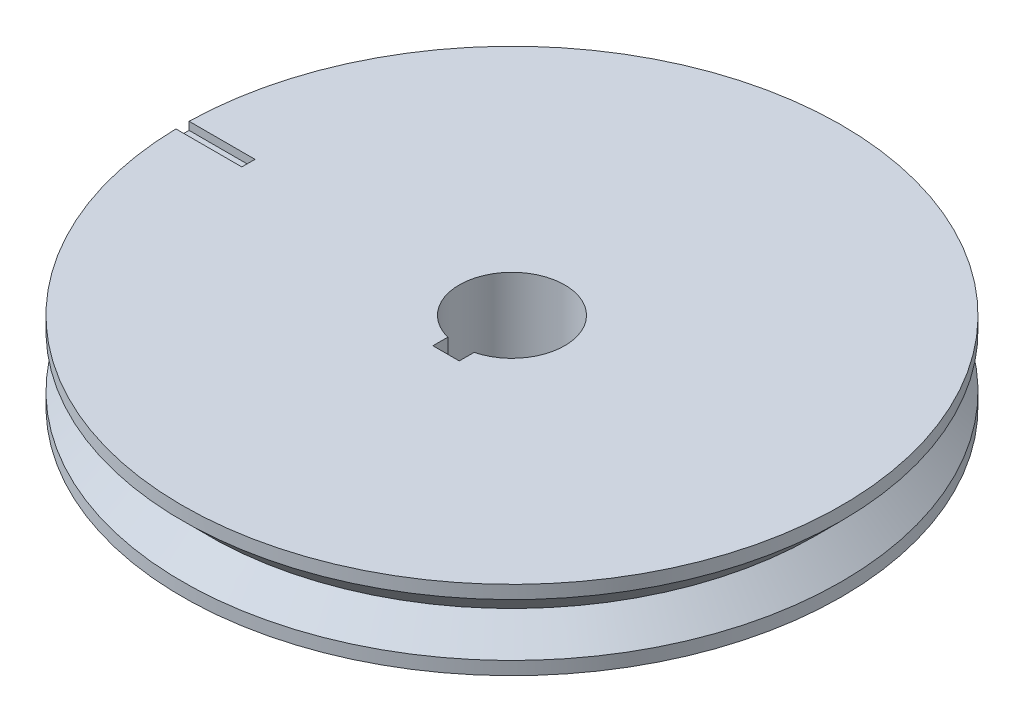
ISO-10303-21;
HEADER;
FILE_DESCRIPTION(('STEP AP214'),'2;1');
FILE_NAME('part.step','',(''),(''),'','','');
FILE_SCHEMA(('AUTOMOTIVE_DESIGN { 1 0 10303 214 1 1 1 1 }'));
ENDSEC;
DATA;
#1=APPLICATION_CONTEXT('core data for automotive mechanical design processes');
#2=APPLICATION_PROTOCOL_DEFINITION('international standard','automotive_design',2000,#1);
#3=PRODUCT_CONTEXT('',#1,'mechanical');
#4=PRODUCT('Part','Part','',(#3));
#5=PRODUCT_RELATED_PRODUCT_CATEGORY('part','',(#4));
#6=PRODUCT_DEFINITION_FORMATION('','',#4);
#7=PRODUCT_DEFINITION_CONTEXT('part definition',#1,'design');
#8=PRODUCT_DEFINITION('design','',#6,#7);
#9=PRODUCT_DEFINITION_SHAPE('','',#8);
#10=(LENGTH_UNIT() NAMED_UNIT(*) SI_UNIT(.MILLI.,.METRE.));
#11=(NAMED_UNIT(*) PLANE_ANGLE_UNIT() SI_UNIT($,.RADIAN.));
#12=(NAMED_UNIT(*) SI_UNIT($,.STERADIAN.) SOLID_ANGLE_UNIT());
#13=UNCERTAINTY_MEASURE_WITH_UNIT(LENGTH_MEASURE(1.E-05),#10,'distance_accuracy_value','');
#14=(GEOMETRIC_REPRESENTATION_CONTEXT(3) GLOBAL_UNCERTAINTY_ASSIGNED_CONTEXT((#13)) GLOBAL_UNIT_ASSIGNED_CONTEXT((#10,
#11,#12)) REPRESENTATION_CONTEXT('',''));
#15=CARTESIAN_POINT('',(0.,0.,0.));
#16=DIRECTION('',(0.,0.,1.));
#17=DIRECTION('',(1.,0.,0.));
#18=AXIS2_PLACEMENT_3D('',#15,#16,#17);
#19=CARTESIAN_POINT('',(0.,-15.,0.));
#20=DIRECTION('',(0.,1.,0.));
#21=DIRECTION('',(-1.,0.,0.));
#22=AXIS2_PLACEMENT_3D('',#19,#20,#21);
#23=PLANE('',#22);
#24=CARTESIAN_POINT('',(0.,-15.,0.));
#25=DIRECTION('',(0.,1.,0.));
#26=DIRECTION('',(-1.,0.,0.));
#27=AXIS2_PLACEMENT_3D('',#24,#25,#26);
#28=CIRCLE('',#27,20.);
#29=CARTESIAN_POINT('',(5.,-15.,19.3649167310371));
#30=VERTEX_POINT('',#29);
#31=CARTESIAN_POINT('',(-5.,-15.,19.3649167310371));
#32=VERTEX_POINT('',#31);
#33=EDGE_CURVE('E151',#30,#32,#28,.T.);
#34=ORIENTED_EDGE('',*,*,#33,.T.);
#35=DIRECTION('',(0.,0.,1.));
#36=VECTOR('',#35,1.);
#37=CARTESIAN_POINT('',(-5.,-15.,19.3649167310371));
#38=LINE('',#37,#36);
#39=CARTESIAN_POINT('',(-5.,-15.,25.));
#40=VERTEX_POINT('',#39);
#41=EDGE_CURVE('E154',#32,#40,#38,.T.);
#42=ORIENTED_EDGE('',*,*,#41,.T.);
#43=DIRECTION('',(1.,0.,0.));
#44=VECTOR('',#43,1.);
#45=CARTESIAN_POINT('',(5.,-15.,25.));
#46=LINE('',#45,#44);
#47=CARTESIAN_POINT('',(5.,-15.,25.));
#48=VERTEX_POINT('',#47);
#49=EDGE_CURVE('E159',#40,#48,#46,.T.);
#50=ORIENTED_EDGE('',*,*,#49,.T.);
#51=DIRECTION('',(0.,0.,-1.));
#52=VECTOR('',#51,1.);
#53=CARTESIAN_POINT('',(5.,-15.,19.3649167310371));
#54=LINE('',#53,#52);
#55=EDGE_CURVE('E56',#48,#30,#54,.T.);
#56=ORIENTED_EDGE('',*,*,#55,.T.);
#57=EDGE_LOOP('',(#34,#42,#50,#56));
#58=FACE_BOUND('',#57,.T.);
#59=CARTESIAN_POINT('',(0.,-15.,0.));
#60=DIRECTION('',(0.,1.,0.));
#61=DIRECTION('',(-1.,0.,0.));
#62=AXIS2_PLACEMENT_3D('',#59,#60,#61);
#63=CIRCLE('',#62,125.);
#64=CARTESIAN_POINT('',(-125.,-15.,0.));
#65=VERTEX_POINT('',#64);
#66=EDGE_CURVE('E11',#65,#65,#63,.T.);
#67=ORIENTED_EDGE('',*,*,#66,.F.);
#68=EDGE_LOOP('',(#67));
#69=FACE_BOUND('',#68,.T.);
#70=ADVANCED_FACE('F34',(#58,#69),#23,.F.);
#71=CARTESIAN_POINT('',(0.,-15.,0.));
#72=DIRECTION('',(0.,1.,0.));
#73=DIRECTION('',(-1.,0.,0.));
#74=AXIS2_PLACEMENT_3D('',#71,#72,#73);
#75=CYLINDRICAL_SURFACE('',#74,125.);
#76=CARTESIAN_POINT('',(0.,-10.,0.));
#77=DIRECTION('',(0.,1.,0.));
#78=DIRECTION('',(-1.,0.,0.));
#79=AXIS2_PLACEMENT_3D('',#76,#77,#78);
#80=CIRCLE('',#79,125.);
#81=CARTESIAN_POINT('',(-125.,-10.,0.));
#82=VERTEX_POINT('',#81);
#83=EDGE_CURVE('E41',#82,#82,#80,.T.);
#84=ORIENTED_EDGE('',*,*,#83,.F.);
#85=EDGE_LOOP('',(#84));
#86=FACE_BOUND('',#85,.T.);
#87=ORIENTED_EDGE('',*,*,#66,.T.);
#88=EDGE_LOOP('',(#87));
#89=FACE_BOUND('',#88,.T.);
#90=ADVANCED_FACE('F139',(#86,#89),#75,.T.);
#91=CARTESIAN_POINT('',(0.,-10.,0.));
#92=DIRECTION('',(0.,-1.,0.));
#93=DIRECTION('',(1.,0.,0.));
#94=AXIS2_PLACEMENT_3D('',#91,#92,#93);
#95=CONICAL_SURFACE('',#94,125.,0.785398163397449);
#96=CARTESIAN_POINT('',(0.,0.,0.));
#97=DIRECTION('',(0.,1.,0.));
#98=DIRECTION('',(-1.,0.,0.));
#99=AXIS2_PLACEMENT_3D('',#96,#97,#98);
#100=CIRCLE('',#99,115.);
#101=CARTESIAN_POINT('',(-115.,0.,0.));
#102=VERTEX_POINT('',#101);
#103=EDGE_CURVE('E125',#102,#102,#100,.T.);
#104=ORIENTED_EDGE('',*,*,#103,.F.);
#105=EDGE_LOOP('',(#104));
#106=FACE_BOUND('',#105,.T.);
#107=ORIENTED_EDGE('',*,*,#83,.T.);
#108=EDGE_LOOP('',(#107));
#109=FACE_BOUND('',#108,.T.);
#110=ADVANCED_FACE('F137',(#106,#109),#95,.T.);
#111=CARTESIAN_POINT('',(0.,0.,0.));
#112=DIRECTION('',(0.,1.,0.));
#113=DIRECTION('',(-1.,0.,0.));
#114=AXIS2_PLACEMENT_3D('',#111,#112,#113);
#115=CONICAL_SURFACE('',#114,115.,0.785398163397449);
#116=CARTESIAN_POINT('',(0.,10.,0.));
#117=DIRECTION('',(0.,1.,0.));
#118=DIRECTION('',(-1.,0.,0.));
#119=AXIS2_PLACEMENT_3D('',#116,#117,#118);
#120=CIRCLE('',#119,125.);
#121=CARTESIAN_POINT('',(-125.,10.,0.));
#122=VERTEX_POINT('',#121);
#123=EDGE_CURVE('E121',#122,#122,#120,.T.);
#124=ORIENTED_EDGE('',*,*,#123,.F.);
#125=EDGE_LOOP('',(#124));
#126=FACE_BOUND('',#125,.T.);
#127=ORIENTED_EDGE('',*,*,#103,.T.);
#128=EDGE_LOOP('',(#127));
#129=FACE_BOUND('',#128,.T.);
#130=ADVANCED_FACE('F229',(#126,#129),#115,.T.);
#131=CARTESIAN_POINT('',(0.,-15.,0.));
#132=DIRECTION('',(0.,1.,0.));
#133=DIRECTION('',(-1.,0.,0.));
#134=AXIS2_PLACEMENT_3D('',#131,#132,#133);
#135=CYLINDRICAL_SURFACE('',#134,125.);
#136=CARTESIAN_POINT('',(0.,15.,0.));
#137=DIRECTION('',(0.,1.,0.));
#138=DIRECTION('',(-1.,0.,0.));
#139=AXIS2_PLACEMENT_3D('',#136,#137,#138);
#140=CIRCLE('',#139,125.);
#141=CARTESIAN_POINT('',(-124.9749974995,15.,2.50000000000004));
#142=VERTEX_POINT('',#141);
#143=CARTESIAN_POINT('',(-124.9749974995,15.,-2.5));
#144=VERTEX_POINT('',#143);
#145=EDGE_CURVE('E114',#142,#144,#140,.T.);
#146=ORIENTED_EDGE('',*,*,#145,.F.);
#147=DIRECTION('',(0.,1.,0.));
#148=VECTOR('',#147,1.);
#149=CARTESIAN_POINT('',(-124.9749974995,12.,2.50000000000004));
#150=LINE('',#149,#148);
#151=CARTESIAN_POINT('',(-124.9749974995,12.,2.50000000000004));
#152=VERTEX_POINT('',#151);
#153=EDGE_CURVE('E116',#152,#142,#150,.T.);
#154=ORIENTED_EDGE('',*,*,#153,.F.);
#155=CARTESIAN_POINT('',(0.,12.,0.));
#156=DIRECTION('',(0.,1.,0.));
#157=DIRECTION('',(-1.,0.,0.));
#158=AXIS2_PLACEMENT_3D('',#155,#156,#157);
#159=CIRCLE('',#158,125.);
#160=CARTESIAN_POINT('',(-124.9749974995,12.,-2.5));
#161=VERTEX_POINT('',#160);
#162=EDGE_CURVE('E115',#161,#152,#159,.T.);
#163=ORIENTED_EDGE('',*,*,#162,.F.);
#164=DIRECTION('',(0.,1.,0.));
#165=VECTOR('',#164,1.);
#166=CARTESIAN_POINT('',(-124.9749974995,12.,-2.5));
#167=LINE('',#166,#165);
#168=EDGE_CURVE('E101',#161,#144,#167,.T.);
#169=ORIENTED_EDGE('',*,*,#168,.T.);
#170=EDGE_LOOP('',(#146,#154,#163,#169));
#171=FACE_BOUND('',#170,.T.);
#172=ORIENTED_EDGE('',*,*,#123,.T.);
#173=EDGE_LOOP('',(#172));
#174=FACE_BOUND('',#173,.T.);
#175=ADVANCED_FACE('F111',(#171,#174),#135,.T.);
#176=CARTESIAN_POINT('',(0.,15.,0.));
#177=DIRECTION('',(0.,-1.,0.));
#178=DIRECTION('',(1.,0.,0.));
#179=AXIS2_PLACEMENT_3D('',#176,#177,#178);
#180=PLANE('',#179);
#181=DIRECTION('',(1.,0.,0.));
#182=VECTOR('',#181,1.);
#183=CARTESIAN_POINT('',(5.,15.,25.));
#184=LINE('',#183,#182);
#185=CARTESIAN_POINT('',(-5.,15.,25.));
#186=VERTEX_POINT('',#185);
#187=CARTESIAN_POINT('',(5.,15.,25.));
#188=VERTEX_POINT('',#187);
#189=EDGE_CURVE('E172',#186,#188,#184,.T.);
#190=ORIENTED_EDGE('',*,*,#189,.F.);
#191=DIRECTION('',(0.,0.,1.));
#192=VECTOR('',#191,1.);
#193=CARTESIAN_POINT('',(-5.,15.,19.3649167310371));
#194=LINE('',#193,#192);
#195=CARTESIAN_POINT('',(-5.,15.,19.3649167310371));
#196=VERTEX_POINT('',#195);
#197=EDGE_CURVE('E176',#196,#186,#194,.T.);
#198=ORIENTED_EDGE('',*,*,#197,.F.);
#199=CARTESIAN_POINT('',(0.,15.,0.));
#200=DIRECTION('',(0.,1.,0.));
#201=DIRECTION('',(-1.,0.,0.));
#202=AXIS2_PLACEMENT_3D('',#199,#200,#201);
#203=CIRCLE('',#202,20.);
#204=CARTESIAN_POINT('',(5.,15.,19.3649167310371));
#205=VERTEX_POINT('',#204);
#206=EDGE_CURVE('E179',#205,#196,#203,.T.);
#207=ORIENTED_EDGE('',*,*,#206,.F.);
#208=DIRECTION('',(0.,0.,-1.));
#209=VECTOR('',#208,1.);
#210=CARTESIAN_POINT('',(5.,15.,19.3649167310371));
#211=LINE('',#210,#209);
#212=EDGE_CURVE('E167',#188,#205,#211,.T.);
#213=ORIENTED_EDGE('',*,*,#212,.F.);
#214=EDGE_LOOP('',(#190,#198,#207,#213));
#215=FACE_BOUND('',#214,.T.);
#216=DIRECTION('',(0.,0.,-1.));
#217=VECTOR('',#216,1.);
#218=CARTESIAN_POINT('',(-99.9749974994999,15.,-2.5));
#219=LINE('',#218,#217);
#220=CARTESIAN_POINT('',(-99.9749974994999,15.,2.5));
#221=VERTEX_POINT('',#220);
#222=CARTESIAN_POINT('',(-99.9749974994999,15.,-2.5));
#223=VERTEX_POINT('',#222);
#224=EDGE_CURVE('E48',#221,#223,#219,.T.);
#225=ORIENTED_EDGE('',*,*,#224,.F.);
#226=DIRECTION('',(1.,0.,0.));
#227=VECTOR('',#226,1.);
#228=CARTESIAN_POINT('',(-99.9749974994999,15.,2.5));
#229=LINE('',#228,#227);
#230=EDGE_CURVE('E106',#142,#221,#229,.T.);
#231=ORIENTED_EDGE('',*,*,#230,.F.);
#232=ORIENTED_EDGE('',*,*,#145,.T.);
#233=DIRECTION('',(-1.,0.,0.));
#234=VECTOR('',#233,1.);
#235=CARTESIAN_POINT('',(-99.9749974994999,15.,-2.5));
#236=LINE('',#235,#234);
#237=EDGE_CURVE('E97',#223,#144,#236,.T.);
#238=ORIENTED_EDGE('',*,*,#237,.F.);
#239=EDGE_LOOP('',(#225,#231,#232,#238));
#240=FACE_BOUND('',#239,.T.);
#241=ADVANCED_FACE('F119',(#215,#240),#180,.F.);
#242=CARTESIAN_POINT('',(-5.,-15.,19.3649167310371));
#243=DIRECTION('',(-1.,0.,0.));
#244=DIRECTION('',(0.,0.,1.));
#245=AXIS2_PLACEMENT_3D('',#242,#243,#244);
#246=PLANE('',#245);
#247=ORIENTED_EDGE('',*,*,#197,.T.);
#248=DIRECTION('',(0.,1.,0.));
#249=VECTOR('',#248,1.);
#250=CARTESIAN_POINT('',(-5.,-15.,25.));
#251=LINE('',#250,#249);
#252=EDGE_CURVE('E130',#40,#186,#251,.T.);
#253=ORIENTED_EDGE('',*,*,#252,.F.);
#254=ORIENTED_EDGE('',*,*,#41,.F.);
#255=DIRECTION('',(0.,1.,0.));
#256=VECTOR('',#255,1.);
#257=CARTESIAN_POINT('',(-5.,-15.,19.3649167310371));
#258=LINE('',#257,#256);
#259=EDGE_CURVE('E122',#32,#196,#258,.T.);
#260=ORIENTED_EDGE('',*,*,#259,.T.);
#261=EDGE_LOOP('',(#247,#253,#254,#260));
#262=FACE_BOUND('',#261,.T.);
#263=ADVANCED_FACE('F219',(#262),#246,.F.);
#264=CARTESIAN_POINT('',(0.,-15.,0.));
#265=DIRECTION('',(0.,1.,0.));
#266=DIRECTION('',(-1.,0.,0.));
#267=AXIS2_PLACEMENT_3D('',#264,#265,#266);
#268=CYLINDRICAL_SURFACE('',#267,20.);
#269=ORIENTED_EDGE('',*,*,#206,.T.);
#270=ORIENTED_EDGE('',*,*,#259,.F.);
#271=ORIENTED_EDGE('',*,*,#33,.F.);
#272=DIRECTION('',(0.,1.,0.));
#273=VECTOR('',#272,1.);
#274=CARTESIAN_POINT('',(5.,-15.,19.3649167310371));
#275=LINE('',#274,#273);
#276=EDGE_CURVE('E127',#30,#205,#275,.T.);
#277=ORIENTED_EDGE('',*,*,#276,.T.);
#278=EDGE_LOOP('',(#269,#270,#271,#277));
#279=FACE_BOUND('',#278,.T.);
#280=ADVANCED_FACE('F216',(#279),#268,.F.);
#281=CARTESIAN_POINT('',(5.,-15.,19.3649167310371));
#282=DIRECTION('',(1.,0.,0.));
#283=DIRECTION('',(0.,0.,-1.));
#284=AXIS2_PLACEMENT_3D('',#281,#282,#283);
#285=PLANE('',#284);
#286=ORIENTED_EDGE('',*,*,#212,.T.);
#287=ORIENTED_EDGE('',*,*,#276,.F.);
#288=ORIENTED_EDGE('',*,*,#55,.F.);
#289=DIRECTION('',(0.,1.,0.));
#290=VECTOR('',#289,1.);
#291=CARTESIAN_POINT('',(5.,-15.,25.));
#292=LINE('',#291,#290);
#293=EDGE_CURVE('E158',#48,#188,#292,.T.);
#294=ORIENTED_EDGE('',*,*,#293,.T.);
#295=EDGE_LOOP('',(#286,#287,#288,#294));
#296=FACE_BOUND('',#295,.T.);
#297=ADVANCED_FACE('F165',(#296),#285,.F.);
#298=CARTESIAN_POINT('',(5.,-15.,25.));
#299=DIRECTION('',(0.,0.,1.));
#300=DIRECTION('',(1.,0.,0.));
#301=AXIS2_PLACEMENT_3D('',#298,#299,#300);
#302=PLANE('',#301);
#303=ORIENTED_EDGE('',*,*,#189,.T.);
#304=ORIENTED_EDGE('',*,*,#293,.F.);
#305=ORIENTED_EDGE('',*,*,#49,.F.);
#306=ORIENTED_EDGE('',*,*,#252,.T.);
#307=EDGE_LOOP('',(#303,#304,#305,#306));
#308=FACE_BOUND('',#307,.T.);
#309=ADVANCED_FACE('F173',(#308),#302,.F.);
#310=CARTESIAN_POINT('',(-99.9749974994999,12.,-2.5));
#311=DIRECTION('',(1.,0.,0.));
#312=DIRECTION('',(0.,1.,0.));
#313=AXIS2_PLACEMENT_3D('',#310,#311,#312);
#314=PLANE('',#313);
#315=ORIENTED_EDGE('',*,*,#224,.T.);
#316=DIRECTION('',(0.,1.,0.));
#317=VECTOR('',#316,1.);
#318=CARTESIAN_POINT('',(-99.9749974994999,12.,-2.5));
#319=LINE('',#318,#317);
#320=CARTESIAN_POINT('',(-99.9749974994999,12.,-2.5));
#321=VERTEX_POINT('',#320);
#322=EDGE_CURVE('E103',#321,#223,#319,.T.);
#323=ORIENTED_EDGE('',*,*,#322,.F.);
#324=DIRECTION('',(0.,0.,-1.));
#325=VECTOR('',#324,1.);
#326=CARTESIAN_POINT('',(-99.9749974994999,12.,-2.5));
#327=LINE('',#326,#325);
#328=CARTESIAN_POINT('',(-99.9749974994999,12.,2.5));
#329=VERTEX_POINT('',#328);
#330=EDGE_CURVE('E195',#329,#321,#327,.T.);
#331=ORIENTED_EDGE('',*,*,#330,.F.);
#332=DIRECTION('',(0.,1.,0.));
#333=VECTOR('',#332,1.);
#334=CARTESIAN_POINT('',(-99.9749974994999,12.,2.5));
#335=LINE('',#334,#333);
#336=EDGE_CURVE('E185',#329,#221,#335,.T.);
#337=ORIENTED_EDGE('',*,*,#336,.T.);
#338=EDGE_LOOP('',(#315,#323,#331,#337));
#339=FACE_BOUND('',#338,.T.);
#340=ADVANCED_FACE('F205',(#339),#314,.F.);
#341=CARTESIAN_POINT('',(-99.9749974994999,12.,2.5));
#342=DIRECTION('',(0.,0.,1.));
#343=DIRECTION('',(1.,0.,0.));
#344=AXIS2_PLACEMENT_3D('',#341,#342,#343);
#345=PLANE('',#344);
#346=ORIENTED_EDGE('',*,*,#230,.T.);
#347=ORIENTED_EDGE('',*,*,#336,.F.);
#348=DIRECTION('',(1.,0.,0.));
#349=VECTOR('',#348,1.);
#350=CARTESIAN_POINT('',(-99.9749974994999,12.,2.5));
#351=LINE('',#350,#349);
#352=EDGE_CURVE('E186',#152,#329,#351,.T.);
#353=ORIENTED_EDGE('',*,*,#352,.F.);
#354=ORIENTED_EDGE('',*,*,#153,.T.);
#355=EDGE_LOOP('',(#346,#347,#353,#354));
#356=FACE_BOUND('',#355,.T.);
#357=ADVANCED_FACE('F200',(#356),#345,.F.);
#358=CARTESIAN_POINT('',(-99.9749974994999,12.,-2.5));
#359=DIRECTION('',(0.,0.,-1.));
#360=DIRECTION('',(-1.,0.,0.));
#361=AXIS2_PLACEMENT_3D('',#358,#359,#360);
#362=PLANE('',#361);
#363=ORIENTED_EDGE('',*,*,#237,.T.);
#364=ORIENTED_EDGE('',*,*,#168,.F.);
#365=DIRECTION('',(-1.,0.,0.));
#366=VECTOR('',#365,1.);
#367=CARTESIAN_POINT('',(-99.9749974994999,12.,-2.5));
#368=LINE('',#367,#366);
#369=EDGE_CURVE('E193',#321,#161,#368,.T.);
#370=ORIENTED_EDGE('',*,*,#369,.F.);
#371=ORIENTED_EDGE('',*,*,#322,.T.);
#372=EDGE_LOOP('',(#363,#364,#370,#371));
#373=FACE_BOUND('',#372,.T.);
#374=ADVANCED_FACE('F99',(#373),#362,.F.);
#375=CARTESIAN_POINT('',(0.,12.,0.));
#376=DIRECTION('',(0.,1.,0.));
#377=DIRECTION('',(-1.,0.,0.));
#378=AXIS2_PLACEMENT_3D('',#375,#376,#377);
#379=PLANE('',#378);
#380=ORIENTED_EDGE('',*,*,#330,.T.);
#381=ORIENTED_EDGE('',*,*,#369,.T.);
#382=ORIENTED_EDGE('',*,*,#162,.T.);
#383=ORIENTED_EDGE('',*,*,#352,.T.);
#384=EDGE_LOOP('',(#380,#381,#382,#383));
#385=FACE_BOUND('',#384,.T.);
#386=ADVANCED_FACE('F204',(#385),#379,.T.);
#387=CLOSED_SHELL('',(#70,#90,#110,#130,#175,#241,#263,#280,#297,#309,#340,#357,#374,#386));
#388=MANIFOLD_SOLID_BREP('B2',#387);
#389=ADVANCED_BREP_SHAPE_REPRESENTATION('',(#18,#388),#14);
#390=SHAPE_DEFINITION_REPRESENTATION(#9,#389);
ENDSEC;
END-ISO-10303-21;
